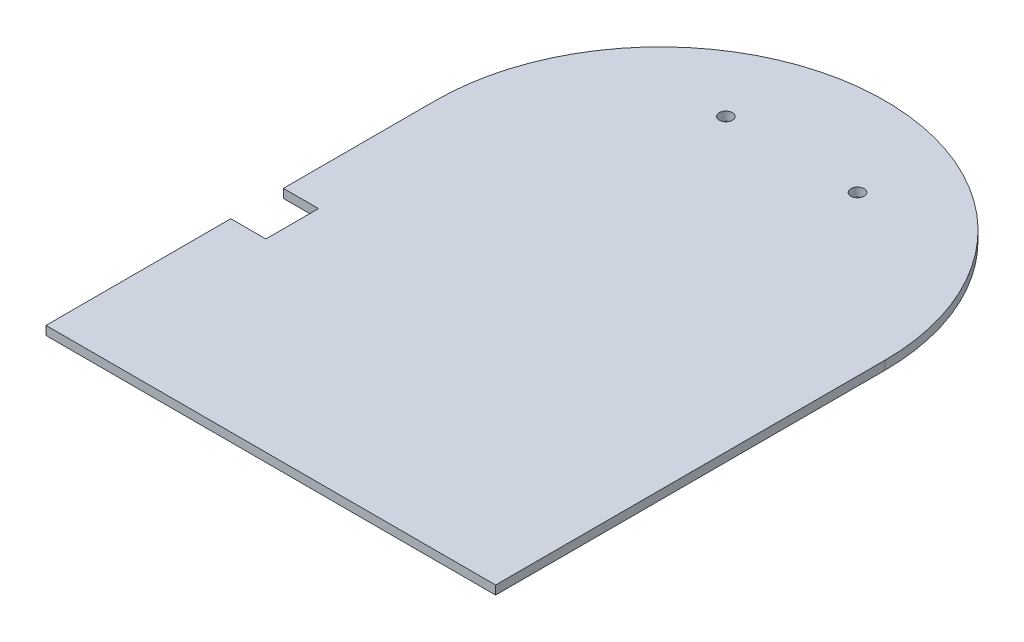
ISO-10303-21;
HEADER;
FILE_DESCRIPTION(('STEP AP214'),'2;1');
FILE_NAME('part.step','',(''),(''),'','','');
FILE_SCHEMA(('AUTOMOTIVE_DESIGN { 1 0 10303 214 1 1 1 1 }'));
ENDSEC;
DATA;
#1=APPLICATION_CONTEXT('core data for automotive mechanical design processes');
#2=APPLICATION_PROTOCOL_DEFINITION('international standard','automotive_design',2000,#1);
#3=PRODUCT_CONTEXT('',#1,'mechanical');
#4=PRODUCT('Part','Part','',(#3));
#5=PRODUCT_RELATED_PRODUCT_CATEGORY('part','',(#4));
#6=PRODUCT_DEFINITION_FORMATION('','',#4);
#7=PRODUCT_DEFINITION_CONTEXT('part definition',#1,'design');
#8=PRODUCT_DEFINITION('design','',#6,#7);
#9=PRODUCT_DEFINITION_SHAPE('','',#8);
#10=(LENGTH_UNIT() NAMED_UNIT(*) SI_UNIT(.MILLI.,.METRE.));
#11=(NAMED_UNIT(*) PLANE_ANGLE_UNIT() SI_UNIT($,.RADIAN.));
#12=(NAMED_UNIT(*) SI_UNIT($,.STERADIAN.) SOLID_ANGLE_UNIT());
#13=UNCERTAINTY_MEASURE_WITH_UNIT(LENGTH_MEASURE(1.E-05),#10,'distance_accuracy_value','');
#14=(GEOMETRIC_REPRESENTATION_CONTEXT(3) GLOBAL_UNCERTAINTY_ASSIGNED_CONTEXT((#13)) GLOBAL_UNIT_ASSIGNED_CONTEXT((#10,
#11,#12)) REPRESENTATION_CONTEXT('',''));
#15=CARTESIAN_POINT('',(0.,0.,0.));
#16=DIRECTION('',(0.,0.,1.));
#17=DIRECTION('',(1.,0.,0.));
#18=AXIS2_PLACEMENT_3D('',#15,#16,#17);
#19=CARTESIAN_POINT('',(0.,2.,0.));
#20=DIRECTION('',(0.,-1.,0.));
#21=DIRECTION('',(0.,0.,-1.));
#22=AXIS2_PLACEMENT_3D('',#19,#20,#21);
#23=PLANE('',#22);
#24=CARTESIAN_POINT('',(0.,2.,0.));
#25=DIRECTION('',(0.,1.,0.));
#26=DIRECTION('',(0.,0.,-1.));
#27=AXIS2_PLACEMENT_3D('',#24,#25,#26);
#28=CIRCLE('',#27,51.25);
#29=CARTESIAN_POINT('',(51.25,2.,0.));
#30=VERTEX_POINT('',#29);
#31=CARTESIAN_POINT('',(-51.25,2.,0.));
#32=VERTEX_POINT('',#31);
#33=EDGE_CURVE('E165',#30,#32,#28,.T.);
#34=ORIENTED_EDGE('',*,*,#33,.T.);
#35=DIRECTION('',(0.,0.,1.));
#36=VECTOR('',#35,1.);
#37=CARTESIAN_POINT('',(-51.25,2.,0.));
#38=LINE('',#37,#36);
#39=CARTESIAN_POINT('',(-51.25,2.,34.6295738095238));
#40=VERTEX_POINT('',#39);
#41=EDGE_CURVE('E102',#32,#40,#38,.T.);
#42=ORIENTED_EDGE('',*,*,#41,.T.);
#43=DIRECTION('',(1.,0.,0.));
#44=VECTOR('',#43,1.);
#45=CARTESIAN_POINT('',(-43.25,2.,34.6295738095238));
#46=LINE('',#45,#44);
#47=CARTESIAN_POINT('',(-43.25,2.,34.6295738095238));
#48=VERTEX_POINT('',#47);
#49=EDGE_CURVE('E204',#40,#48,#46,.T.);
#50=ORIENTED_EDGE('',*,*,#49,.T.);
#51=DIRECTION('',(0.,0.,1.));
#52=VECTOR('',#51,1.);
#53=CARTESIAN_POINT('',(-43.25,2.,46.6295738095238));
#54=LINE('',#53,#52);
#55=CARTESIAN_POINT('',(-43.25,2.,46.6295738095238));
#56=VERTEX_POINT('',#55);
#57=EDGE_CURVE('E207',#48,#56,#54,.T.);
#58=ORIENTED_EDGE('',*,*,#57,.T.);
#59=DIRECTION('',(-1.,0.,0.));
#60=VECTOR('',#59,1.);
#61=CARTESIAN_POINT('',(-43.25,2.,46.6295738095238));
#62=LINE('',#61,#60);
#63=CARTESIAN_POINT('',(-51.25,2.,46.6295738095238));
#64=VERTEX_POINT('',#63);
#65=EDGE_CURVE('E121',#56,#64,#62,.T.);
#66=ORIENTED_EDGE('',*,*,#65,.T.);
#67=DIRECTION('',(0.,0.,1.));
#68=VECTOR('',#67,1.);
#69=CARTESIAN_POINT('',(-51.25,2.,46.6295738095238));
#70=LINE('',#69,#68);
#71=CARTESIAN_POINT('',(-51.25,2.,88.75));
#72=VERTEX_POINT('',#71);
#73=EDGE_CURVE('E115',#64,#72,#70,.T.);
#74=ORIENTED_EDGE('',*,*,#73,.T.);
#75=DIRECTION('',(1.,0.,0.));
#76=VECTOR('',#75,1.);
#77=CARTESIAN_POINT('',(-51.25,2.,88.75));
#78=LINE('',#77,#76);
#79=CARTESIAN_POINT('',(51.25,2.,88.75));
#80=VERTEX_POINT('',#79);
#81=EDGE_CURVE('E119',#72,#80,#78,.T.);
#82=ORIENTED_EDGE('',*,*,#81,.T.);
#83=DIRECTION('',(0.,0.,-1.));
#84=VECTOR('',#83,1.);
#85=CARTESIAN_POINT('',(51.25,2.,0.));
#86=LINE('',#85,#84);
#87=EDGE_CURVE('E59',#80,#30,#86,.T.);
#88=ORIENTED_EDGE('',*,*,#87,.T.);
#89=EDGE_LOOP('',(#34,#42,#50,#58,#66,#74,#82,#88));
#90=FACE_BOUND('',#89,.T.);
#91=CARTESIAN_POINT('',(-15.,2.,-30.));
#92=DIRECTION('',(0.,1.,0.));
#93=DIRECTION('',(0.,0.,1.));
#94=AXIS2_PLACEMENT_3D('',#91,#92,#93);
#95=CIRCLE('',#94,1.5);
#96=CARTESIAN_POINT('',(-15.,2.,-28.5));
#97=VERTEX_POINT('',#96);
#98=EDGE_CURVE('E192',#97,#97,#95,.F.);
#99=ORIENTED_EDGE('',*,*,#98,.T.);
#100=EDGE_LOOP('',(#99));
#101=FACE_BOUND('',#100,.T.);
#102=CARTESIAN_POINT('',(15.,2.,-30.));
#103=DIRECTION('',(0.,1.,0.));
#104=DIRECTION('',(0.,0.,1.));
#105=AXIS2_PLACEMENT_3D('',#102,#103,#104);
#106=CIRCLE('',#105,1.5);
#107=CARTESIAN_POINT('',(15.,2.,-28.5));
#108=VERTEX_POINT('',#107);
#109=EDGE_CURVE('E185',#108,#108,#106,.T.);
#110=ORIENTED_EDGE('',*,*,#109,.F.);
#111=EDGE_LOOP('',(#110));
#112=FACE_BOUND('',#111,.T.);
#113=ADVANCED_FACE('F39',(#90,#101,#112),#23,.F.);
#114=CARTESIAN_POINT('',(0.,0.,0.));
#115=DIRECTION('',(0.,-1.,0.));
#116=DIRECTION('',(0.,0.,-1.));
#117=AXIS2_PLACEMENT_3D('',#114,#115,#116);
#118=PLANE('',#117);
#119=CARTESIAN_POINT('',(-15.,0.,-30.));
#120=DIRECTION('',(0.,-1.,0.));
#121=DIRECTION('',(0.,0.,-1.));
#122=AXIS2_PLACEMENT_3D('',#119,#120,#121);
#123=CIRCLE('',#122,1.5);
#124=CARTESIAN_POINT('',(-15.,0.,-31.5));
#125=VERTEX_POINT('',#124);
#126=EDGE_CURVE('E182',#125,#125,#123,.F.);
#127=ORIENTED_EDGE('',*,*,#126,.T.);
#128=EDGE_LOOP('',(#127));
#129=FACE_BOUND('',#128,.T.);
#130=CARTESIAN_POINT('',(0.,0.,0.));
#131=DIRECTION('',(0.,1.,0.));
#132=DIRECTION('',(0.,0.,-1.));
#133=AXIS2_PLACEMENT_3D('',#130,#131,#132);
#134=CIRCLE('',#133,51.25);
#135=CARTESIAN_POINT('',(51.25,0.,0.));
#136=VERTEX_POINT('',#135);
#137=CARTESIAN_POINT('',(-51.25,0.,0.));
#138=VERTEX_POINT('',#137);
#139=EDGE_CURVE('E143',#136,#138,#134,.T.);
#140=ORIENTED_EDGE('',*,*,#139,.F.);
#141=DIRECTION('',(0.,0.,-1.));
#142=VECTOR('',#141,1.);
#143=CARTESIAN_POINT('',(51.25,0.,0.));
#144=LINE('',#143,#142);
#145=CARTESIAN_POINT('',(51.25,0.,88.75));
#146=VERTEX_POINT('',#145);
#147=EDGE_CURVE('E94',#146,#136,#144,.T.);
#148=ORIENTED_EDGE('',*,*,#147,.F.);
#149=DIRECTION('',(1.,0.,0.));
#150=VECTOR('',#149,1.);
#151=CARTESIAN_POINT('',(-51.25,0.,88.75));
#152=LINE('',#151,#150);
#153=CARTESIAN_POINT('',(-51.25,0.,88.75));
#154=VERTEX_POINT('',#153);
#155=EDGE_CURVE('E88',#154,#146,#152,.T.);
#156=ORIENTED_EDGE('',*,*,#155,.F.);
#157=DIRECTION('',(0.,0.,1.));
#158=VECTOR('',#157,1.);
#159=CARTESIAN_POINT('',(-51.25,0.,46.6295738095238));
#160=LINE('',#159,#158);
#161=CARTESIAN_POINT('',(-51.25,0.,46.6295738095238));
#162=VERTEX_POINT('',#161);
#163=EDGE_CURVE('E130',#162,#154,#160,.T.);
#164=ORIENTED_EDGE('',*,*,#163,.F.);
#165=DIRECTION('',(-1.,0.,0.));
#166=VECTOR('',#165,1.);
#167=CARTESIAN_POINT('',(-43.25,0.,46.6295738095238));
#168=LINE('',#167,#166);
#169=CARTESIAN_POINT('',(-43.25,0.,46.6295738095238));
#170=VERTEX_POINT('',#169);
#171=EDGE_CURVE('E156',#170,#162,#168,.T.);
#172=ORIENTED_EDGE('',*,*,#171,.F.);
#173=DIRECTION('',(0.,0.,1.));
#174=VECTOR('',#173,1.);
#175=CARTESIAN_POINT('',(-43.25,0.,46.6295738095238));
#176=LINE('',#175,#174);
#177=CARTESIAN_POINT('',(-43.25,0.,34.6295738095238));
#178=VERTEX_POINT('',#177);
#179=EDGE_CURVE('E153',#178,#170,#176,.T.);
#180=ORIENTED_EDGE('',*,*,#179,.F.);
#181=DIRECTION('',(1.,0.,0.));
#182=VECTOR('',#181,1.);
#183=CARTESIAN_POINT('',(-43.25,0.,34.6295738095238));
#184=LINE('',#183,#182);
#185=CARTESIAN_POINT('',(-51.25,0.,34.6295738095238));
#186=VERTEX_POINT('',#185);
#187=EDGE_CURVE('E150',#186,#178,#184,.T.);
#188=ORIENTED_EDGE('',*,*,#187,.F.);
#189=DIRECTION('',(0.,0.,1.));
#190=VECTOR('',#189,1.);
#191=CARTESIAN_POINT('',(-51.25,0.,0.));
#192=LINE('',#191,#190);
#193=EDGE_CURVE('E147',#138,#186,#192,.T.);
#194=ORIENTED_EDGE('',*,*,#193,.F.);
#195=EDGE_LOOP('',(#140,#148,#156,#164,#172,#180,#188,#194));
#196=FACE_BOUND('',#195,.T.);
#197=CARTESIAN_POINT('',(15.,0.,-30.));
#198=DIRECTION('',(0.,-1.,0.));
#199=DIRECTION('',(0.,0.,-1.));
#200=AXIS2_PLACEMENT_3D('',#197,#198,#199);
#201=CIRCLE('',#200,1.5);
#202=CARTESIAN_POINT('',(15.,0.,-31.5));
#203=VERTEX_POINT('',#202);
#204=EDGE_CURVE('E43',#203,#203,#201,.T.);
#205=ORIENTED_EDGE('',*,*,#204,.F.);
#206=EDGE_LOOP('',(#205));
#207=FACE_BOUND('',#206,.T.);
#208=ADVANCED_FACE('F222',(#129,#196,#207),#118,.T.);
#209=CARTESIAN_POINT('',(0.,2.,0.));
#210=DIRECTION('',(0.,-1.,0.));
#211=DIRECTION('',(0.,0.,-1.));
#212=AXIS2_PLACEMENT_3D('',#209,#210,#211);
#213=CYLINDRICAL_SURFACE('',#212,51.25);
#214=ORIENTED_EDGE('',*,*,#139,.T.);
#215=DIRECTION('',(0.,-1.,0.));
#216=VECTOR('',#215,1.);
#217=CARTESIAN_POINT('',(-51.25,2.,0.));
#218=LINE('',#217,#216);
#219=EDGE_CURVE('E11',#32,#138,#218,.T.);
#220=ORIENTED_EDGE('',*,*,#219,.F.);
#221=ORIENTED_EDGE('',*,*,#33,.F.);
#222=DIRECTION('',(0.,-1.,0.));
#223=VECTOR('',#222,1.);
#224=CARTESIAN_POINT('',(51.25,2.,0.));
#225=LINE('',#224,#223);
#226=EDGE_CURVE('E139',#30,#136,#225,.T.);
#227=ORIENTED_EDGE('',*,*,#226,.T.);
#228=EDGE_LOOP('',(#214,#220,#221,#227));
#229=FACE_BOUND('',#228,.T.);
#230=ADVANCED_FACE('F41',(#229),#213,.T.);
#231=CARTESIAN_POINT('',(-51.25,2.,0.));
#232=DIRECTION('',(1.,0.,0.));
#233=DIRECTION('',(0.,0.,-1.));
#234=AXIS2_PLACEMENT_3D('',#231,#232,#233);
#235=PLANE('',#234);
#236=ORIENTED_EDGE('',*,*,#193,.T.);
#237=DIRECTION('',(0.,-1.,0.));
#238=VECTOR('',#237,1.);
#239=CARTESIAN_POINT('',(-51.25,2.,34.6295738095238));
#240=LINE('',#239,#238);
#241=EDGE_CURVE('E50',#40,#186,#240,.T.);
#242=ORIENTED_EDGE('',*,*,#241,.F.);
#243=ORIENTED_EDGE('',*,*,#41,.F.);
#244=ORIENTED_EDGE('',*,*,#219,.T.);
#245=EDGE_LOOP('',(#236,#242,#243,#244));
#246=FACE_BOUND('',#245,.T.);
#247=ADVANCED_FACE('F311',(#246),#235,.F.);
#248=CARTESIAN_POINT('',(-43.25,2.,34.6295738095238));
#249=DIRECTION('',(0.,0.,-1.));
#250=DIRECTION('',(-1.,0.,0.));
#251=AXIS2_PLACEMENT_3D('',#248,#249,#250);
#252=PLANE('',#251);
#253=ORIENTED_EDGE('',*,*,#187,.T.);
#254=DIRECTION('',(0.,-1.,0.));
#255=VECTOR('',#254,1.);
#256=CARTESIAN_POINT('',(-43.25,2.,34.6295738095238));
#257=LINE('',#256,#255);
#258=EDGE_CURVE('E176',#48,#178,#257,.T.);
#259=ORIENTED_EDGE('',*,*,#258,.F.);
#260=ORIENTED_EDGE('',*,*,#49,.F.);
#261=ORIENTED_EDGE('',*,*,#241,.T.);
#262=EDGE_LOOP('',(#253,#259,#260,#261));
#263=FACE_BOUND('',#262,.T.);
#264=ADVANCED_FACE('F302',(#263),#252,.F.);
#265=CARTESIAN_POINT('',(-43.25,2.,46.6295738095238));
#266=DIRECTION('',(1.,0.,0.));
#267=DIRECTION('',(0.,0.,-1.));
#268=AXIS2_PLACEMENT_3D('',#265,#266,#267);
#269=PLANE('',#268);
#270=ORIENTED_EDGE('',*,*,#179,.T.);
#271=DIRECTION('',(0.,-1.,0.));
#272=VECTOR('',#271,1.);
#273=CARTESIAN_POINT('',(-43.25,2.,46.6295738095238));
#274=LINE('',#273,#272);
#275=EDGE_CURVE('E172',#56,#170,#274,.T.);
#276=ORIENTED_EDGE('',*,*,#275,.F.);
#277=ORIENTED_EDGE('',*,*,#57,.F.);
#278=ORIENTED_EDGE('',*,*,#258,.T.);
#279=EDGE_LOOP('',(#270,#276,#277,#278));
#280=FACE_BOUND('',#279,.T.);
#281=ADVANCED_FACE('F215',(#280),#269,.F.);
#282=CARTESIAN_POINT('',(-43.25,2.,46.6295738095238));
#283=DIRECTION('',(0.,0.,1.));
#284=DIRECTION('',(1.,0.,0.));
#285=AXIS2_PLACEMENT_3D('',#282,#283,#284);
#286=PLANE('',#285);
#287=ORIENTED_EDGE('',*,*,#171,.T.);
#288=DIRECTION('',(0.,-1.,0.));
#289=VECTOR('',#288,1.);
#290=CARTESIAN_POINT('',(-51.25,2.,46.6295738095238));
#291=LINE('',#290,#289);
#292=EDGE_CURVE('E132',#64,#162,#291,.T.);
#293=ORIENTED_EDGE('',*,*,#292,.F.);
#294=ORIENTED_EDGE('',*,*,#65,.F.);
#295=ORIENTED_EDGE('',*,*,#275,.T.);
#296=EDGE_LOOP('',(#287,#293,#294,#295));
#297=FACE_BOUND('',#296,.T.);
#298=ADVANCED_FACE('F219',(#297),#286,.F.);
#299=CARTESIAN_POINT('',(-51.25,2.,46.6295738095238));
#300=DIRECTION('',(1.,0.,0.));
#301=DIRECTION('',(0.,0.,-1.));
#302=AXIS2_PLACEMENT_3D('',#299,#300,#301);
#303=PLANE('',#302);
#304=ORIENTED_EDGE('',*,*,#163,.T.);
#305=DIRECTION('',(0.,-1.,0.));
#306=VECTOR('',#305,1.);
#307=CARTESIAN_POINT('',(-51.25,2.,88.75));
#308=LINE('',#307,#306);
#309=EDGE_CURVE('E127',#72,#154,#308,.T.);
#310=ORIENTED_EDGE('',*,*,#309,.F.);
#311=ORIENTED_EDGE('',*,*,#73,.F.);
#312=ORIENTED_EDGE('',*,*,#292,.T.);
#313=EDGE_LOOP('',(#304,#310,#311,#312));
#314=FACE_BOUND('',#313,.T.);
#315=ADVANCED_FACE('F128',(#314),#303,.F.);
#316=CARTESIAN_POINT('',(-51.25,2.,88.75));
#317=DIRECTION('',(0.,0.,-1.));
#318=DIRECTION('',(-1.,0.,0.));
#319=AXIS2_PLACEMENT_3D('',#316,#317,#318);
#320=PLANE('',#319);
#321=ORIENTED_EDGE('',*,*,#155,.T.);
#322=DIRECTION('',(0.,-1.,0.));
#323=VECTOR('',#322,1.);
#324=CARTESIAN_POINT('',(51.25,2.,88.75));
#325=LINE('',#324,#323);
#326=EDGE_CURVE('E133',#80,#146,#325,.T.);
#327=ORIENTED_EDGE('',*,*,#326,.F.);
#328=ORIENTED_EDGE('',*,*,#81,.F.);
#329=ORIENTED_EDGE('',*,*,#309,.T.);
#330=EDGE_LOOP('',(#321,#327,#328,#329));
#331=FACE_BOUND('',#330,.T.);
#332=ADVANCED_FACE('F135',(#331),#320,.F.);
#333=CARTESIAN_POINT('',(51.25,2.,0.));
#334=DIRECTION('',(-1.,0.,0.));
#335=DIRECTION('',(0.,0.,1.));
#336=AXIS2_PLACEMENT_3D('',#333,#334,#335);
#337=PLANE('',#336);
#338=ORIENTED_EDGE('',*,*,#147,.T.);
#339=ORIENTED_EDGE('',*,*,#226,.F.);
#340=ORIENTED_EDGE('',*,*,#87,.F.);
#341=ORIENTED_EDGE('',*,*,#326,.T.);
#342=EDGE_LOOP('',(#338,#339,#340,#341));
#343=FACE_BOUND('',#342,.T.);
#344=ADVANCED_FACE('F228',(#343),#337,.F.);
#345=CARTESIAN_POINT('',(-15.,-8.,-30.));
#346=DIRECTION('',(0.,1.,0.));
#347=DIRECTION('',(0.,0.,1.));
#348=AXIS2_PLACEMENT_3D('',#345,#346,#347);
#349=CYLINDRICAL_SURFACE('',#348,1.5);
#350=ORIENTED_EDGE('',*,*,#126,.F.);
#351=EDGE_LOOP('',(#350));
#352=FACE_BOUND('',#351,.T.);
#353=ORIENTED_EDGE('',*,*,#98,.F.);
#354=EDGE_LOOP('',(#353));
#355=FACE_BOUND('',#354,.T.);
#356=ADVANCED_FACE('F230',(#352,#355),#349,.F.);
#357=CARTESIAN_POINT('',(15.,-8.,-30.));
#358=DIRECTION('',(0.,1.,0.));
#359=DIRECTION('',(0.,0.,1.));
#360=AXIS2_PLACEMENT_3D('',#357,#358,#359);
#361=CYLINDRICAL_SURFACE('',#360,1.5);
#362=ORIENTED_EDGE('',*,*,#204,.T.);
#363=EDGE_LOOP('',(#362));
#364=FACE_BOUND('',#363,.T.);
#365=ORIENTED_EDGE('',*,*,#109,.T.);
#366=EDGE_LOOP('',(#365));
#367=FACE_BOUND('',#366,.T.);
#368=ADVANCED_FACE('F236',(#364,#367),#361,.F.);
#369=CLOSED_SHELL('',(#113,#208,#230,#247,#264,#281,#298,#315,#332,#344,#356,#368));
#370=MANIFOLD_SOLID_BREP('B2',#369);
#371=ADVANCED_BREP_SHAPE_REPRESENTATION('',(#18,#370),#14);
#372=SHAPE_DEFINITION_REPRESENTATION(#9,#371);
ENDSEC;
END-ISO-10303-21;
